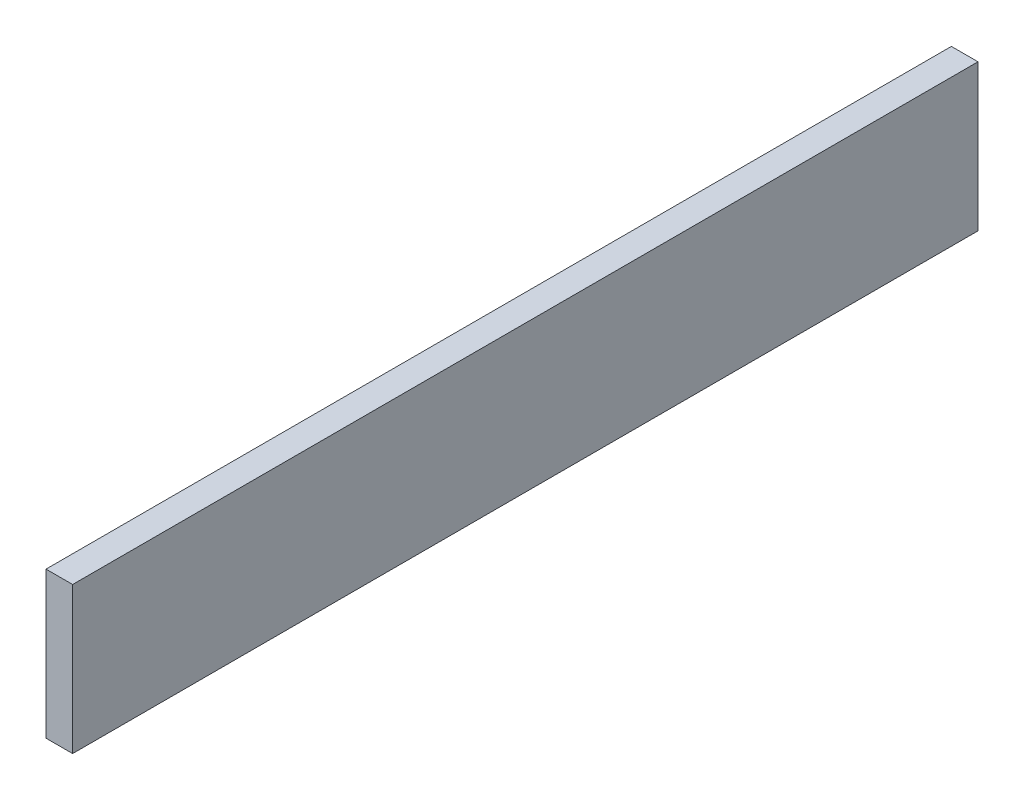
ISO-10303-21;
HEADER;
FILE_DESCRIPTION(('STEP AP214'),'2;1');
FILE_NAME('part.step','',(''),(''),'','','');
FILE_SCHEMA(('AUTOMOTIVE_DESIGN { 1 0 10303 214 1 1 1 1 }'));
ENDSEC;
DATA;
#1=APPLICATION_CONTEXT('core data for automotive mechanical design processes');
#2=APPLICATION_PROTOCOL_DEFINITION('international standard','automotive_design',2000,#1);
#3=PRODUCT_CONTEXT('',#1,'mechanical');
#4=PRODUCT('Part','Part','',(#3));
#5=PRODUCT_RELATED_PRODUCT_CATEGORY('part','',(#4));
#6=PRODUCT_DEFINITION_FORMATION('','',#4);
#7=PRODUCT_DEFINITION_CONTEXT('part definition',#1,'design');
#8=PRODUCT_DEFINITION('design','',#6,#7);
#9=PRODUCT_DEFINITION_SHAPE('','',#8);
#10=(LENGTH_UNIT() NAMED_UNIT(*) SI_UNIT(.MILLI.,.METRE.));
#11=(NAMED_UNIT(*) PLANE_ANGLE_UNIT() SI_UNIT($,.RADIAN.));
#12=(NAMED_UNIT(*) SI_UNIT($,.STERADIAN.) SOLID_ANGLE_UNIT());
#13=UNCERTAINTY_MEASURE_WITH_UNIT(LENGTH_MEASURE(1.E-05),#10,'distance_accuracy_value','');
#14=(GEOMETRIC_REPRESENTATION_CONTEXT(3) GLOBAL_UNCERTAINTY_ASSIGNED_CONTEXT((#13)) GLOBAL_UNIT_ASSIGNED_CONTEXT((#10,
#11,#12)) REPRESENTATION_CONTEXT('',''));
#15=CARTESIAN_POINT('',(0.,0.,0.));
#16=DIRECTION('',(0.,0.,1.));
#17=DIRECTION('',(1.,0.,0.));
#18=AXIS2_PLACEMENT_3D('',#15,#16,#17);
#19=CARTESIAN_POINT('',(12.7,34.925,-215.9));
#20=DIRECTION('',(0.,0.,-1.));
#21=DIRECTION('',(0.,1.,0.));
#22=AXIS2_PLACEMENT_3D('',#19,#20,#21);
#23=PLANE('',#22);
#24=DIRECTION('',(0.,-1.,0.));
#25=VECTOR('',#24,1.);
#26=CARTESIAN_POINT('',(0.,34.925,-215.9));
#27=LINE('',#26,#25);
#28=CARTESIAN_POINT('',(0.,34.925,-215.9));
#29=VERTEX_POINT('',#28);
#30=CARTESIAN_POINT('',(0.,-34.925,-215.9));
#31=VERTEX_POINT('',#30);
#32=EDGE_CURVE('E98',#29,#31,#27,.T.);
#33=ORIENTED_EDGE('',*,*,#32,.F.);
#34=DIRECTION('',(-1.,0.,0.));
#35=VECTOR('',#34,1.);
#36=CARTESIAN_POINT('',(12.7,34.925,-215.9));
#37=LINE('',#36,#35);
#38=CARTESIAN_POINT('',(12.7,34.925,-215.9));
#39=VERTEX_POINT('',#38);
#40=EDGE_CURVE('E11',#39,#29,#37,.T.);
#41=ORIENTED_EDGE('',*,*,#40,.F.);
#42=DIRECTION('',(0.,-1.,0.));
#43=VECTOR('',#42,1.);
#44=CARTESIAN_POINT('',(12.7,34.925,-215.9));
#45=LINE('',#44,#43);
#46=CARTESIAN_POINT('',(12.7,-34.925,-215.9));
#47=VERTEX_POINT('',#46);
#48=EDGE_CURVE('E93',#39,#47,#45,.T.);
#49=ORIENTED_EDGE('',*,*,#48,.T.);
#50=DIRECTION('',(-1.,0.,0.));
#51=VECTOR('',#50,1.);
#52=CARTESIAN_POINT('',(12.7,-34.925,-215.9));
#53=LINE('',#52,#51);
#54=EDGE_CURVE('E36',#47,#31,#53,.T.);
#55=ORIENTED_EDGE('',*,*,#54,.T.);
#56=EDGE_LOOP('',(#33,#41,#49,#55));
#57=FACE_BOUND('',#56,.T.);
#58=ADVANCED_FACE('F33',(#57),#23,.T.);
#59=CARTESIAN_POINT('',(12.7,34.925,-215.9));
#60=DIRECTION('',(0.,-1.,0.));
#61=DIRECTION('',(0.,0.,-1.));
#62=AXIS2_PLACEMENT_3D('',#59,#60,#61);
#63=PLANE('',#62);
#64=DIRECTION('',(0.,0.,1.));
#65=VECTOR('',#64,1.);
#66=CARTESIAN_POINT('',(0.,34.925,-215.9));
#67=LINE('',#66,#65);
#68=CARTESIAN_POINT('',(0.,34.925,215.9));
#69=VERTEX_POINT('',#68);
#70=EDGE_CURVE('E66',#29,#69,#67,.T.);
#71=ORIENTED_EDGE('',*,*,#70,.T.);
#72=DIRECTION('',(-1.,0.,0.));
#73=VECTOR('',#72,1.);
#74=CARTESIAN_POINT('',(12.7,34.925,215.9));
#75=LINE('',#74,#73);
#76=CARTESIAN_POINT('',(12.7,34.925,215.9));
#77=VERTEX_POINT('',#76);
#78=EDGE_CURVE('E42',#77,#69,#75,.T.);
#79=ORIENTED_EDGE('',*,*,#78,.F.);
#80=DIRECTION('',(0.,0.,1.));
#81=VECTOR('',#80,1.);
#82=CARTESIAN_POINT('',(12.7,34.925,-215.9));
#83=LINE('',#82,#81);
#84=EDGE_CURVE('E83',#39,#77,#83,.T.);
#85=ORIENTED_EDGE('',*,*,#84,.F.);
#86=ORIENTED_EDGE('',*,*,#40,.T.);
#87=EDGE_LOOP('',(#71,#79,#85,#86));
#88=FACE_BOUND('',#87,.T.);
#89=ADVANCED_FACE('F108',(#88),#63,.F.);
#90=CARTESIAN_POINT('',(12.7,34.925,215.9));
#91=DIRECTION('',(0.,0.,-1.));
#92=DIRECTION('',(-1.,0.,0.));
#93=AXIS2_PLACEMENT_3D('',#90,#91,#92);
#94=PLANE('',#93);
#95=DIRECTION('',(0.,-1.,0.));
#96=VECTOR('',#95,1.);
#97=CARTESIAN_POINT('',(0.,34.925,215.9));
#98=LINE('',#97,#96);
#99=CARTESIAN_POINT('',(0.,-34.925,215.9));
#100=VERTEX_POINT('',#99);
#101=EDGE_CURVE('E90',#69,#100,#98,.T.);
#102=ORIENTED_EDGE('',*,*,#101,.T.);
#103=DIRECTION('',(-1.,0.,0.));
#104=VECTOR('',#103,1.);
#105=CARTESIAN_POINT('',(12.7,-34.925,215.9));
#106=LINE('',#105,#104);
#107=CARTESIAN_POINT('',(12.7,-34.925,215.9));
#108=VERTEX_POINT('',#107);
#109=EDGE_CURVE('E87',#108,#100,#106,.T.);
#110=ORIENTED_EDGE('',*,*,#109,.F.);
#111=DIRECTION('',(0.,-1.,0.));
#112=VECTOR('',#111,1.);
#113=CARTESIAN_POINT('',(12.7,34.925,215.9));
#114=LINE('',#113,#112);
#115=EDGE_CURVE('E78',#77,#108,#114,.T.);
#116=ORIENTED_EDGE('',*,*,#115,.F.);
#117=ORIENTED_EDGE('',*,*,#78,.T.);
#118=EDGE_LOOP('',(#102,#110,#116,#117));
#119=FACE_BOUND('',#118,.T.);
#120=ADVANCED_FACE('F88',(#119),#94,.F.);
#121=CARTESIAN_POINT('',(12.7,-34.925,-215.9));
#122=DIRECTION('',(0.,-1.,0.));
#123=DIRECTION('',(0.,0.,-1.));
#124=AXIS2_PLACEMENT_3D('',#121,#122,#123);
#125=PLANE('',#124);
#126=DIRECTION('',(0.,0.,1.));
#127=VECTOR('',#126,1.);
#128=CARTESIAN_POINT('',(0.,-34.925,-215.9));
#129=LINE('',#128,#127);
#130=EDGE_CURVE('E101',#31,#100,#129,.T.);
#131=ORIENTED_EDGE('',*,*,#130,.F.);
#132=ORIENTED_EDGE('',*,*,#54,.F.);
#133=DIRECTION('',(0.,0.,1.));
#134=VECTOR('',#133,1.);
#135=CARTESIAN_POINT('',(12.7,-34.925,-215.9));
#136=LINE('',#135,#134);
#137=EDGE_CURVE('E82',#47,#108,#136,.T.);
#138=ORIENTED_EDGE('',*,*,#137,.T.);
#139=ORIENTED_EDGE('',*,*,#109,.T.);
#140=EDGE_LOOP('',(#131,#132,#138,#139));
#141=FACE_BOUND('',#140,.T.);
#142=ADVANCED_FACE('F92',(#141),#125,.T.);
#143=CARTESIAN_POINT('',(12.7,0.,0.));
#144=DIRECTION('',(-1.,0.,0.));
#145=DIRECTION('',(0.,0.,1.));
#146=AXIS2_PLACEMENT_3D('',#143,#144,#145);
#147=PLANE('',#146);
#148=ORIENTED_EDGE('',*,*,#48,.F.);
#149=ORIENTED_EDGE('',*,*,#84,.T.);
#150=ORIENTED_EDGE('',*,*,#115,.T.);
#151=ORIENTED_EDGE('',*,*,#137,.F.);
#152=EDGE_LOOP('',(#148,#149,#150,#151));
#153=FACE_BOUND('',#152,.T.);
#154=ADVANCED_FACE('F81',(#153),#147,.F.);
#155=CARTESIAN_POINT('',(0.,0.,0.));
#156=DIRECTION('',(-1.,0.,0.));
#157=DIRECTION('',(0.,0.,1.));
#158=AXIS2_PLACEMENT_3D('',#155,#156,#157);
#159=PLANE('',#158);
#160=ORIENTED_EDGE('',*,*,#32,.T.);
#161=ORIENTED_EDGE('',*,*,#130,.T.);
#162=ORIENTED_EDGE('',*,*,#101,.F.);
#163=ORIENTED_EDGE('',*,*,#70,.F.);
#164=EDGE_LOOP('',(#160,#161,#162,#163));
#165=FACE_BOUND('',#164,.T.);
#166=ADVANCED_FACE('F106',(#165),#159,.T.);
#167=CLOSED_SHELL('',(#58,#89,#120,#142,#154,#166));
#168=MANIFOLD_SOLID_BREP('B2',#167);
#169=ADVANCED_BREP_SHAPE_REPRESENTATION('',(#18,#168),#14);
#170=SHAPE_DEFINITION_REPRESENTATION(#9,#169);
ENDSEC;
END-ISO-10303-21;
